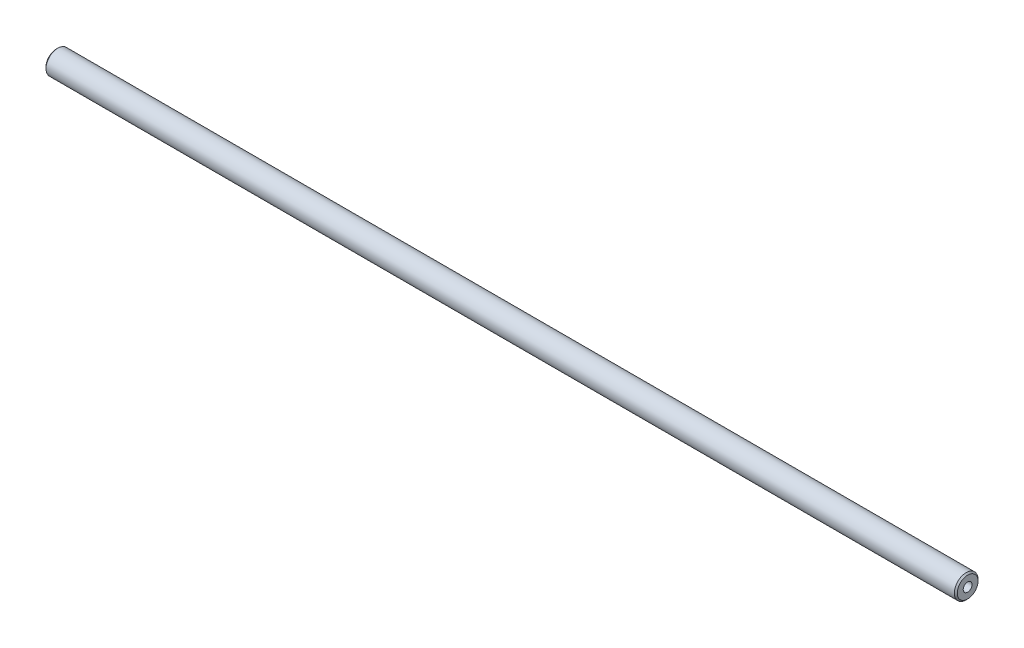
ISO-10303-21;
HEADER;
FILE_DESCRIPTION(('STEP AP214'),'2;1');
FILE_NAME('part.step','',(''),(''),'','','');
FILE_SCHEMA(('AUTOMOTIVE_DESIGN { 1 0 10303 214 1 1 1 1 }'));
ENDSEC;
DATA;
#1=APPLICATION_CONTEXT('core data for automotive mechanical design processes');
#2=APPLICATION_PROTOCOL_DEFINITION('international standard','automotive_design',2000,#1);
#3=PRODUCT_CONTEXT('',#1,'mechanical');
#4=PRODUCT('Part','Part','',(#3));
#5=PRODUCT_RELATED_PRODUCT_CATEGORY('part','',(#4));
#6=PRODUCT_DEFINITION_FORMATION('','',#4);
#7=PRODUCT_DEFINITION_CONTEXT('part definition',#1,'design');
#8=PRODUCT_DEFINITION('design','',#6,#7);
#9=PRODUCT_DEFINITION_SHAPE('','',#8);
#10=(LENGTH_UNIT() NAMED_UNIT(*) SI_UNIT(.MILLI.,.METRE.));
#11=(NAMED_UNIT(*) PLANE_ANGLE_UNIT() SI_UNIT($,.RADIAN.));
#12=(NAMED_UNIT(*) SI_UNIT($,.STERADIAN.) SOLID_ANGLE_UNIT());
#13=UNCERTAINTY_MEASURE_WITH_UNIT(LENGTH_MEASURE(1.E-05),#10,'distance_accuracy_value','');
#14=(GEOMETRIC_REPRESENTATION_CONTEXT(3) GLOBAL_UNCERTAINTY_ASSIGNED_CONTEXT((#13)) GLOBAL_UNIT_ASSIGNED_CONTEXT((#10,
#11,#12)) REPRESENTATION_CONTEXT('',''));
#15=CARTESIAN_POINT('',(0.,0.,0.));
#16=DIRECTION('',(0.,0.,1.));
#17=DIRECTION('',(1.,0.,0.));
#18=AXIS2_PLACEMENT_3D('',#15,#16,#17);
#19=CARTESIAN_POINT('',(146.,0.,0.));
#20=DIRECTION('',(1.,0.,0.));
#21=DIRECTION('',(0.,0.,-1.));
#22=AXIS2_PLACEMENT_3D('',#19,#20,#21);
#23=PLANE('',#22);
#24=CARTESIAN_POINT('',(146.,0.,0.));
#25=DIRECTION('',(-1.,0.,0.));
#26=DIRECTION('',(0.,0.,1.));
#27=AXIS2_PLACEMENT_3D('',#24,#25,#26);
#28=CIRCLE('',#27,1.5);
#29=CARTESIAN_POINT('',(146.,0.,-1.5));
#30=VERTEX_POINT('',#29);
#31=EDGE_CURVE('E11',#30,#30,#28,.T.);
#32=ORIENTED_EDGE('',*,*,#31,.F.);
#33=EDGE_LOOP('',(#32));
#34=FACE_BOUND('',#33,.T.);
#35=ADVANCED_FACE('F17',(#34),#23,.T.);
#36=CARTESIAN_POINT('',(154.,0.,0.));
#37=DIRECTION('',(1.,0.,0.));
#38=DIRECTION('',(0.,0.,1.));
#39=AXIS2_PLACEMENT_3D('',#36,#37,#38);
#40=CYLINDRICAL_SURFACE('',#39,1.5);
#41=CARTESIAN_POINT('',(154.,0.,0.));
#42=DIRECTION('',(-1.,0.,0.));
#43=DIRECTION('',(0.,0.,1.));
#44=AXIS2_PLACEMENT_3D('',#41,#42,#43);
#45=CIRCLE('',#44,1.5);
#46=CARTESIAN_POINT('',(154.,0.,-1.5));
#47=VERTEX_POINT('',#46);
#48=EDGE_CURVE('E21',#47,#47,#45,.T.);
#49=ORIENTED_EDGE('',*,*,#48,.F.);
#50=EDGE_LOOP('',(#49));
#51=FACE_BOUND('',#50,.T.);
#52=ORIENTED_EDGE('',*,*,#31,.T.);
#53=EDGE_LOOP('',(#52));
#54=FACE_BOUND('',#53,.T.);
#55=ADVANCED_FACE('F92',(#51,#54),#40,.F.);
#56=CARTESIAN_POINT('',(-146.,0.,0.));
#57=DIRECTION('',(1.,0.,0.));
#58=DIRECTION('',(0.,0.,-1.));
#59=AXIS2_PLACEMENT_3D('',#56,#57,#58);
#60=PLANE('',#59);
#61=CARTESIAN_POINT('',(-146.,0.,0.));
#62=DIRECTION('',(1.,0.,0.));
#63=DIRECTION('',(0.,0.,-1.));
#64=AXIS2_PLACEMENT_3D('',#61,#62,#63);
#65=CIRCLE('',#64,1.5);
#66=CARTESIAN_POINT('',(-146.,0.,1.5));
#67=VERTEX_POINT('',#66);
#68=EDGE_CURVE('E28',#67,#67,#65,.T.);
#69=ORIENTED_EDGE('',*,*,#68,.F.);
#70=EDGE_LOOP('',(#69));
#71=FACE_BOUND('',#70,.T.);
#72=ADVANCED_FACE('F99',(#71),#60,.F.);
#73=CARTESIAN_POINT('',(-154.,0.,0.));
#74=DIRECTION('',(-1.,0.,0.));
#75=DIRECTION('',(0.,0.,-1.));
#76=AXIS2_PLACEMENT_3D('',#73,#74,#75);
#77=CYLINDRICAL_SURFACE('',#76,1.5);
#78=CARTESIAN_POINT('',(-154.,0.,0.));
#79=DIRECTION('',(1.,0.,0.));
#80=DIRECTION('',(0.,0.,-1.));
#81=AXIS2_PLACEMENT_3D('',#78,#79,#80);
#82=CIRCLE('',#81,1.5);
#83=CARTESIAN_POINT('',(-154.,0.,1.5));
#84=VERTEX_POINT('',#83);
#85=EDGE_CURVE('E63',#84,#84,#82,.T.);
#86=ORIENTED_EDGE('',*,*,#85,.F.);
#87=EDGE_LOOP('',(#86));
#88=FACE_BOUND('',#87,.T.);
#89=ORIENTED_EDGE('',*,*,#68,.T.);
#90=EDGE_LOOP('',(#89));
#91=FACE_BOUND('',#90,.T.);
#92=ADVANCED_FACE('F103',(#88,#91),#77,.F.);
#93=CARTESIAN_POINT('',(-154.,0.,0.));
#94=DIRECTION('',(1.,0.,0.));
#95=DIRECTION('',(0.,0.,-1.));
#96=AXIS2_PLACEMENT_3D('',#93,#94,#95);
#97=PLANE('',#96);
#98=CARTESIAN_POINT('',(-154.,0.,0.));
#99=DIRECTION('',(1.,0.,0.));
#100=DIRECTION('',(0.,-1.,0.));
#101=AXIS2_PLACEMENT_3D('',#98,#99,#100);
#102=CIRCLE('',#101,3.5);
#103=CARTESIAN_POINT('',(-154.,3.5,0.));
#104=VERTEX_POINT('',#103);
#105=EDGE_CURVE('E59',#104,#104,#102,.T.);
#106=ORIENTED_EDGE('',*,*,#105,.F.);
#107=EDGE_LOOP('',(#106));
#108=FACE_BOUND('',#107,.T.);
#109=ORIENTED_EDGE('',*,*,#85,.T.);
#110=EDGE_LOOP('',(#109));
#111=FACE_BOUND('',#110,.T.);
#112=ADVANCED_FACE('F64',(#108,#111),#97,.F.);
#113=CARTESIAN_POINT('',(-153.75,0.,0.));
#114=DIRECTION('',(1.,0.,0.));
#115=DIRECTION('',(0.,-1.,0.));
#116=AXIS2_PLACEMENT_3D('',#113,#114,#115);
#117=CONICAL_SURFACE('',#116,3.75,0.785398163397441);
#118=ORIENTED_EDGE('',*,*,#105,.T.);
#119=EDGE_LOOP('',(#118));
#120=FACE_BOUND('',#119,.T.);
#121=CARTESIAN_POINT('',(-153.5,0.,0.));
#122=DIRECTION('',(-1.,0.,0.));
#123=DIRECTION('',(0.,-1.,0.));
#124=AXIS2_PLACEMENT_3D('',#121,#122,#123);
#125=CIRCLE('',#124,4.);
#126=CARTESIAN_POINT('',(-153.5,4.,0.));
#127=VERTEX_POINT('',#126);
#128=EDGE_CURVE('E72',#127,#127,#125,.T.);
#129=ORIENTED_EDGE('',*,*,#128,.T.);
#130=EDGE_LOOP('',(#129));
#131=FACE_BOUND('',#130,.T.);
#132=ADVANCED_FACE('F76',(#120,#131),#117,.T.);
#133=CARTESIAN_POINT('',(154.,0.,0.));
#134=DIRECTION('',(1.,0.,0.));
#135=DIRECTION('',(0.,0.,-1.));
#136=AXIS2_PLACEMENT_3D('',#133,#134,#135);
#137=PLANE('',#136);
#138=CARTESIAN_POINT('',(154.,0.,0.));
#139=DIRECTION('',(-1.,0.,0.));
#140=DIRECTION('',(0.,-1.,0.));
#141=AXIS2_PLACEMENT_3D('',#138,#139,#140);
#142=CIRCLE('',#141,3.5);
#143=CARTESIAN_POINT('',(154.,3.5,0.));
#144=VERTEX_POINT('',#143);
#145=EDGE_CURVE('E47',#144,#144,#142,.T.);
#146=ORIENTED_EDGE('',*,*,#145,.F.);
#147=EDGE_LOOP('',(#146));
#148=FACE_BOUND('',#147,.T.);
#149=ORIENTED_EDGE('',*,*,#48,.T.);
#150=EDGE_LOOP('',(#149));
#151=FACE_BOUND('',#150,.T.);
#152=ADVANCED_FACE('F19',(#148,#151),#137,.T.);
#153=CARTESIAN_POINT('',(0.,0.,0.));
#154=DIRECTION('',(-1.,0.,0.));
#155=DIRECTION('',(0.,-1.,0.));
#156=AXIS2_PLACEMENT_3D('',#153,#154,#155);
#157=CYLINDRICAL_SURFACE('',#156,4.);
#158=CARTESIAN_POINT('',(153.5,0.,0.));
#159=DIRECTION('',(1.,0.,0.));
#160=DIRECTION('',(0.,-1.,0.));
#161=AXIS2_PLACEMENT_3D('',#158,#159,#160);
#162=CIRCLE('',#161,4.);
#163=CARTESIAN_POINT('',(153.5,4.,0.));
#164=VERTEX_POINT('',#163);
#165=EDGE_CURVE('E52',#164,#164,#162,.T.);
#166=ORIENTED_EDGE('',*,*,#165,.F.);
#167=EDGE_LOOP('',(#166));
#168=FACE_BOUND('',#167,.T.);
#169=ORIENTED_EDGE('',*,*,#128,.F.);
#170=EDGE_LOOP('',(#169));
#171=FACE_BOUND('',#170,.T.);
#172=ADVANCED_FACE('F78',(#168,#171),#157,.T.);
#173=CARTESIAN_POINT('',(153.75,0.,0.));
#174=DIRECTION('',(-1.,0.,0.));
#175=DIRECTION('',(0.,-1.,0.));
#176=AXIS2_PLACEMENT_3D('',#173,#174,#175);
#177=CONICAL_SURFACE('',#176,3.75,0.785398163397441);
#178=ORIENTED_EDGE('',*,*,#145,.T.);
#179=EDGE_LOOP('',(#178));
#180=FACE_BOUND('',#179,.T.);
#181=ORIENTED_EDGE('',*,*,#165,.T.);
#182=EDGE_LOOP('',(#181));
#183=FACE_BOUND('',#182,.T.);
#184=ADVANCED_FACE('F80',(#180,#183),#177,.T.);
#185=CLOSED_SHELL('',(#35,#55,#72,#92,#112,#132,#152,#172,#184));
#186=MANIFOLD_SOLID_BREP('B1',#185);
#187=ADVANCED_BREP_SHAPE_REPRESENTATION('',(#18,#186),#14);
#188=SHAPE_DEFINITION_REPRESENTATION(#9,#187);
ENDSEC;
END-ISO-10303-21;
